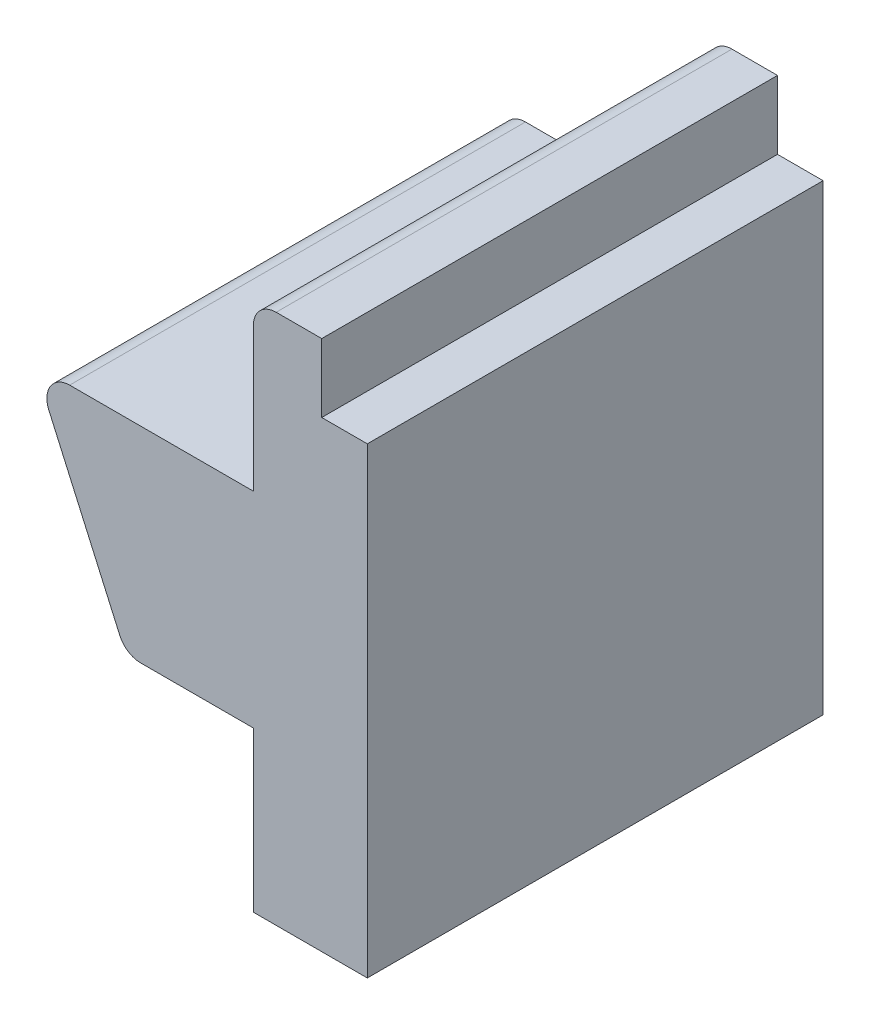
ISO-10303-21;
HEADER;
FILE_DESCRIPTION(('STEP AP214'),'2;1');
FILE_NAME('part.step','',(''),(''),'','','');
FILE_SCHEMA(('AUTOMOTIVE_DESIGN { 1 0 10303 214 1 1 1 1 }'));
ENDSEC;
DATA;
#1=APPLICATION_CONTEXT('core data for automotive mechanical design processes');
#2=APPLICATION_PROTOCOL_DEFINITION('international standard','automotive_design',2000,#1);
#3=PRODUCT_CONTEXT('',#1,'mechanical');
#4=PRODUCT('Part','Part','',(#3));
#5=PRODUCT_RELATED_PRODUCT_CATEGORY('part','',(#4));
#6=PRODUCT_DEFINITION_FORMATION('','',#4);
#7=PRODUCT_DEFINITION_CONTEXT('part definition',#1,'design');
#8=PRODUCT_DEFINITION('design','',#6,#7);
#9=PRODUCT_DEFINITION_SHAPE('','',#8);
#10=(LENGTH_UNIT() NAMED_UNIT(*) SI_UNIT(.MILLI.,.METRE.));
#11=(NAMED_UNIT(*) PLANE_ANGLE_UNIT() SI_UNIT($,.RADIAN.));
#12=(NAMED_UNIT(*) SI_UNIT($,.STERADIAN.) SOLID_ANGLE_UNIT());
#13=UNCERTAINTY_MEASURE_WITH_UNIT(LENGTH_MEASURE(1.E-05),#10,'distance_accuracy_value','');
#14=(GEOMETRIC_REPRESENTATION_CONTEXT(3) GLOBAL_UNCERTAINTY_ASSIGNED_CONTEXT((#13)) GLOBAL_UNIT_ASSIGNED_CONTEXT((#10,
#11,#12)) REPRESENTATION_CONTEXT('',''));
#15=CARTESIAN_POINT('',(0.,0.,0.));
#16=DIRECTION('',(0.,0.,1.));
#17=DIRECTION('',(1.,0.,0.));
#18=AXIS2_PLACEMENT_3D('',#15,#16,#17);
#19=CARTESIAN_POINT('',(-2.,23.3,20.));
#20=DIRECTION('',(-1.,0.,0.));
#21=DIRECTION('',(0.,-1.,0.));
#22=AXIS2_PLACEMENT_3D('',#19,#20,#21);
#23=PLANE('',#22);
#24=DIRECTION('',(0.,1.,0.));
#25=VECTOR('',#24,1.);
#26=CARTESIAN_POINT('',(-2.,23.3,0.));
#27=LINE('',#26,#25);
#28=CARTESIAN_POINT('',(-2.,20.3,0.));
#29=VERTEX_POINT('',#28);
#30=CARTESIAN_POINT('',(-2.,23.3,0.));
#31=VERTEX_POINT('',#30);
#32=EDGE_CURVE('E151',#29,#31,#27,.T.);
#33=ORIENTED_EDGE('',*,*,#32,.T.);
#34=DIRECTION('',(0.,0.,-1.));
#35=VECTOR('',#34,1.);
#36=CARTESIAN_POINT('',(-2.,23.3,20.));
#37=LINE('',#36,#35);
#38=CARTESIAN_POINT('',(-2.,23.3,20.));
#39=VERTEX_POINT('',#38);
#40=EDGE_CURVE('E133',#39,#31,#37,.T.);
#41=ORIENTED_EDGE('',*,*,#40,.F.);
#42=DIRECTION('',(0.,1.,0.));
#43=VECTOR('',#42,1.);
#44=CARTESIAN_POINT('',(-2.,23.3,20.));
#45=LINE('',#44,#43);
#46=CARTESIAN_POINT('',(-2.,20.3,20.));
#47=VERTEX_POINT('',#46);
#48=EDGE_CURVE('E139',#47,#39,#45,.T.);
#49=ORIENTED_EDGE('',*,*,#48,.F.);
#50=DIRECTION('',(0.,0.,-1.));
#51=VECTOR('',#50,1.);
#52=CARTESIAN_POINT('',(-2.,20.3,20.));
#53=LINE('',#52,#51);
#54=EDGE_CURVE('E207',#47,#29,#53,.T.);
#55=ORIENTED_EDGE('',*,*,#54,.T.);
#56=EDGE_LOOP('',(#33,#41,#49,#55));
#57=FACE_BOUND('',#56,.T.);
#58=ADVANCED_FACE('F33',(#57),#23,.F.);
#59=CARTESIAN_POINT('',(-2.,23.3,20.));
#60=DIRECTION('',(0.,-1.,0.));
#61=DIRECTION('',(0.,0.,-1.));
#62=AXIS2_PLACEMENT_3D('',#59,#60,#61);
#63=PLANE('',#62);
#64=DIRECTION('',(-1.,0.,0.));
#65=VECTOR('',#64,1.);
#66=CARTESIAN_POINT('',(-2.,23.3,0.));
#67=LINE('',#66,#65);
#68=CARTESIAN_POINT('',(-4.,23.3,0.));
#69=VERTEX_POINT('',#68);
#70=EDGE_CURVE('E245',#31,#69,#67,.T.);
#71=ORIENTED_EDGE('',*,*,#70,.T.);
#72=DIRECTION('',(0.,0.,-1.));
#73=VECTOR('',#72,1.);
#74=CARTESIAN_POINT('',(-4.,23.3,20.));
#75=LINE('',#74,#73);
#76=CARTESIAN_POINT('',(-4.,23.3,20.));
#77=VERTEX_POINT('',#76);
#78=EDGE_CURVE('E136',#69,#77,#75,.F.);
#79=ORIENTED_EDGE('',*,*,#78,.T.);
#80=DIRECTION('',(-1.,0.,0.));
#81=VECTOR('',#80,1.);
#82=CARTESIAN_POINT('',(-2.,23.3,20.));
#83=LINE('',#82,#81);
#84=EDGE_CURVE('E128',#39,#77,#83,.T.);
#85=ORIENTED_EDGE('',*,*,#84,.F.);
#86=ORIENTED_EDGE('',*,*,#40,.T.);
#87=EDGE_LOOP('',(#71,#79,#85,#86));
#88=FACE_BOUND('',#87,.T.);
#89=ADVANCED_FACE('F131',(#88),#63,.F.);
#90=CARTESIAN_POINT('',(-5.,16.,20.));
#91=DIRECTION('',(1.,0.,0.));
#92=DIRECTION('',(0.,0.,-1.));
#93=AXIS2_PLACEMENT_3D('',#90,#91,#92);
#94=PLANE('',#93);
#95=DIRECTION('',(0.,-1.,0.));
#96=VECTOR('',#95,1.);
#97=CARTESIAN_POINT('',(-5.,16.,20.));
#98=LINE('',#97,#96);
#99=CARTESIAN_POINT('',(-5.,22.3,20.));
#100=VERTEX_POINT('',#99);
#101=CARTESIAN_POINT('',(-5.,16.,20.));
#102=VERTEX_POINT('',#101);
#103=EDGE_CURVE('E138',#100,#102,#98,.T.);
#104=ORIENTED_EDGE('',*,*,#103,.F.);
#105=DIRECTION('',(0.,0.,-1.));
#106=VECTOR('',#105,1.);
#107=CARTESIAN_POINT('',(-5.,22.3,20.));
#108=LINE('',#107,#106);
#109=CARTESIAN_POINT('',(-5.,22.3,0.));
#110=VERTEX_POINT('',#109);
#111=EDGE_CURVE('E152',#100,#110,#108,.T.);
#112=ORIENTED_EDGE('',*,*,#111,.T.);
#113=DIRECTION('',(0.,-1.,0.));
#114=VECTOR('',#113,1.);
#115=CARTESIAN_POINT('',(-5.,16.,0.));
#116=LINE('',#115,#114);
#117=CARTESIAN_POINT('',(-5.,16.,0.));
#118=VERTEX_POINT('',#117);
#119=EDGE_CURVE('E197',#110,#118,#116,.T.);
#120=ORIENTED_EDGE('',*,*,#119,.T.);
#121=DIRECTION('',(0.,0.,-1.));
#122=VECTOR('',#121,1.);
#123=CARTESIAN_POINT('',(-5.,16.,20.));
#124=LINE('',#123,#122);
#125=EDGE_CURVE('E153',#102,#118,#124,.T.);
#126=ORIENTED_EDGE('',*,*,#125,.F.);
#127=EDGE_LOOP('',(#104,#112,#120,#126));
#128=FACE_BOUND('',#127,.T.);
#129=ADVANCED_FACE('F250',(#128),#94,.F.);
#130=CARTESIAN_POINT('',(-5.,16.,20.));
#131=DIRECTION('',(0.,-1.,0.));
#132=DIRECTION('',(0.,0.,-1.));
#133=AXIS2_PLACEMENT_3D('',#130,#131,#132);
#134=PLANE('',#133);
#135=DIRECTION('',(-1.,0.,0.));
#136=VECTOR('',#135,1.);
#137=CARTESIAN_POINT('',(-5.,16.,0.));
#138=LINE('',#137,#136);
#139=CARTESIAN_POINT('',(-13.0612380220227,16.,0.));
#140=VERTEX_POINT('',#139);
#141=EDGE_CURVE('E193',#118,#140,#138,.T.);
#142=ORIENTED_EDGE('',*,*,#141,.T.);
#143=DIRECTION('',(0.,0.,-1.));
#144=VECTOR('',#143,1.);
#145=CARTESIAN_POINT('',(-13.0612380220227,16.,20.));
#146=LINE('',#145,#144);
#147=CARTESIAN_POINT('',(-13.0612380220227,16.,20.));
#148=VERTEX_POINT('',#147);
#149=EDGE_CURVE('E11',#140,#148,#146,.F.);
#150=ORIENTED_EDGE('',*,*,#149,.T.);
#151=DIRECTION('',(-1.,0.,0.));
#152=VECTOR('',#151,1.);
#153=CARTESIAN_POINT('',(-5.,16.,20.));
#154=LINE('',#153,#152);
#155=EDGE_CURVE('E257',#102,#148,#154,.T.);
#156=ORIENTED_EDGE('',*,*,#155,.F.);
#157=ORIENTED_EDGE('',*,*,#125,.T.);
#158=EDGE_LOOP('',(#142,#150,#156,#157));
#159=FACE_BOUND('',#158,.T.);
#160=ADVANCED_FACE('F254',(#159),#134,.F.);
#161=CARTESIAN_POINT('',(-14.6,16.,20.));
#162=DIRECTION('',(0.913811548620257,0.406138466053448,0.));
#163=DIRECTION('',(-0.406138466053448,0.913811548620257,0.));
#164=AXIS2_PLACEMENT_3D('',#161,#162,#163);
#165=PLANE('',#164);
#166=DIRECTION('',(0.406138466053448,-0.913811548620257,0.));
#167=VECTOR('',#166,1.);
#168=CARTESIAN_POINT('',(-14.6,16.,0.));
#169=LINE('',#168,#167);
#170=CARTESIAN_POINT('',(-13.9750495706429,14.5938615339466,0.));
#171=VERTEX_POINT('',#170);
#172=CARTESIAN_POINT('',(-10.8639384595318,7.59386153394655,0.));
#173=VERTEX_POINT('',#172);
#174=EDGE_CURVE('E182',#171,#173,#169,.T.);
#175=ORIENTED_EDGE('',*,*,#174,.T.);
#176=DIRECTION('',(0.,0.,-1.));
#177=VECTOR('',#176,1.);
#178=CARTESIAN_POINT('',(-10.8639384595318,7.59386153394655,20.));
#179=LINE('',#178,#177);
#180=CARTESIAN_POINT('',(-10.8639384595318,7.59386153394655,20.));
#181=VERTEX_POINT('',#180);
#182=EDGE_CURVE('E41',#173,#181,#179,.F.);
#183=ORIENTED_EDGE('',*,*,#182,.T.);
#184=DIRECTION('',(0.406138466053448,-0.913811548620257,0.));
#185=VECTOR('',#184,1.);
#186=CARTESIAN_POINT('',(-14.6,16.,20.));
#187=LINE('',#186,#185);
#188=CARTESIAN_POINT('',(-13.9750495706429,14.5938615339466,20.));
#189=VERTEX_POINT('',#188);
#190=EDGE_CURVE('E183',#189,#181,#187,.T.);
#191=ORIENTED_EDGE('',*,*,#190,.F.);
#192=DIRECTION('',(0.,0.,-1.));
#193=VECTOR('',#192,1.);
#194=CARTESIAN_POINT('',(-13.9750495706429,14.5938615339466,20.));
#195=LINE('',#194,#193);
#196=EDGE_CURVE('E177',#189,#171,#195,.T.);
#197=ORIENTED_EDGE('',*,*,#196,.T.);
#198=EDGE_LOOP('',(#175,#183,#191,#197));
#199=FACE_BOUND('',#198,.T.);
#200=ADVANCED_FACE('F181',(#199),#165,.F.);
#201=CARTESIAN_POINT('',(-10.6,7.,20.));
#202=DIRECTION('',(0.,1.,0.));
#203=DIRECTION('',(0.,0.,1.));
#204=AXIS2_PLACEMENT_3D('',#201,#202,#203);
#205=PLANE('',#204);
#206=DIRECTION('',(1.,0.,0.));
#207=VECTOR('',#206,1.);
#208=CARTESIAN_POINT('',(-10.6,7.,20.));
#209=LINE('',#208,#207);
#210=CARTESIAN_POINT('',(-9.95012691091155,7.,20.));
#211=VERTEX_POINT('',#210);
#212=CARTESIAN_POINT('',(-5.,7.,20.));
#213=VERTEX_POINT('',#212);
#214=EDGE_CURVE('E259',#211,#213,#209,.T.);
#215=ORIENTED_EDGE('',*,*,#214,.F.);
#216=DIRECTION('',(0.,0.,-1.));
#217=VECTOR('',#216,1.);
#218=CARTESIAN_POINT('',(-9.95012691091155,7.,20.));
#219=LINE('',#218,#217);
#220=CARTESIAN_POINT('',(-9.95012691091155,7.,0.));
#221=VERTEX_POINT('',#220);
#222=EDGE_CURVE('E174',#211,#221,#219,.T.);
#223=ORIENTED_EDGE('',*,*,#222,.T.);
#224=DIRECTION('',(1.,0.,0.));
#225=VECTOR('',#224,1.);
#226=CARTESIAN_POINT('',(-10.6,7.,0.));
#227=LINE('',#226,#225);
#228=CARTESIAN_POINT('',(-5.,7.,0.));
#229=VERTEX_POINT('',#228);
#230=EDGE_CURVE('E192',#221,#229,#227,.T.);
#231=ORIENTED_EDGE('',*,*,#230,.T.);
#232=DIRECTION('',(0.,0.,-1.));
#233=VECTOR('',#232,1.);
#234=CARTESIAN_POINT('',(-5.,7.,20.));
#235=LINE('',#234,#233);
#236=EDGE_CURVE('E159',#213,#229,#235,.T.);
#237=ORIENTED_EDGE('',*,*,#236,.F.);
#238=EDGE_LOOP('',(#215,#223,#231,#237));
#239=FACE_BOUND('',#238,.T.);
#240=ADVANCED_FACE('F264',(#239),#205,.F.);
#241=CARTESIAN_POINT('',(-5.,7.,20.));
#242=DIRECTION('',(1.,0.,0.));
#243=DIRECTION('',(0.,1.,0.));
#244=AXIS2_PLACEMENT_3D('',#241,#242,#243);
#245=PLANE('',#244);
#246=DIRECTION('',(0.,-1.,0.));
#247=VECTOR('',#246,1.);
#248=CARTESIAN_POINT('',(-5.,7.,0.));
#249=LINE('',#248,#247);
#250=CARTESIAN_POINT('',(-5.,0.,0.));
#251=VERTEX_POINT('',#250);
#252=EDGE_CURVE('E195',#229,#251,#249,.T.);
#253=ORIENTED_EDGE('',*,*,#252,.T.);
#254=DIRECTION('',(0.,0.,-1.));
#255=VECTOR('',#254,1.);
#256=CARTESIAN_POINT('',(-5.,0.,20.));
#257=LINE('',#256,#255);
#258=CARTESIAN_POINT('',(-5.,0.,20.));
#259=VERTEX_POINT('',#258);
#260=EDGE_CURVE('E215',#259,#251,#257,.T.);
#261=ORIENTED_EDGE('',*,*,#260,.F.);
#262=DIRECTION('',(0.,-1.,0.));
#263=VECTOR('',#262,1.);
#264=CARTESIAN_POINT('',(-5.,7.,20.));
#265=LINE('',#264,#263);
#266=EDGE_CURVE('E224',#213,#259,#265,.T.);
#267=ORIENTED_EDGE('',*,*,#266,.F.);
#268=ORIENTED_EDGE('',*,*,#236,.T.);
#269=EDGE_LOOP('',(#253,#261,#267,#268));
#270=FACE_BOUND('',#269,.T.);
#271=ADVANCED_FACE('F222',(#270),#245,.F.);
#272=CARTESIAN_POINT('',(-5.,0.,20.));
#273=DIRECTION('',(0.,1.,0.));
#274=DIRECTION('',(0.,0.,1.));
#275=AXIS2_PLACEMENT_3D('',#272,#273,#274);
#276=PLANE('',#275);
#277=CARTESIAN_POINT('',(-2.5,0.,4.));
#278=DIRECTION('',(0.,-1.,0.));
#279=DIRECTION('',(0.,0.,-1.));
#280=AXIS2_PLACEMENT_3D('',#277,#278,#279);
#281=CIRCLE('',#280,2.);
#282=CARTESIAN_POINT('',(-2.5,0.,2.));
#283=VERTEX_POINT('',#282);
#284=EDGE_CURVE('E324',#283,#283,#281,.T.);
#285=ORIENTED_EDGE('',*,*,#284,.F.);
#286=EDGE_LOOP('',(#285));
#287=FACE_BOUND('',#286,.T.);
#288=CARTESIAN_POINT('',(-2.5,0.,16.));
#289=DIRECTION('',(0.,-1.,0.));
#290=DIRECTION('',(0.,0.,-1.));
#291=AXIS2_PLACEMENT_3D('',#288,#289,#290);
#292=CIRCLE('',#291,2.);
#293=CARTESIAN_POINT('',(-2.5,0.,14.));
#294=VERTEX_POINT('',#293);
#295=EDGE_CURVE('E332',#294,#294,#292,.T.);
#296=ORIENTED_EDGE('',*,*,#295,.F.);
#297=EDGE_LOOP('',(#296));
#298=FACE_BOUND('',#297,.T.);
#299=DIRECTION('',(1.,0.,0.));
#300=VECTOR('',#299,1.);
#301=CARTESIAN_POINT('',(-5.,0.,0.));
#302=LINE('',#301,#300);
#303=CARTESIAN_POINT('',(0.,0.,0.));
#304=VERTEX_POINT('',#303);
#305=EDGE_CURVE('E202',#251,#304,#302,.T.);
#306=ORIENTED_EDGE('',*,*,#305,.T.);
#307=DIRECTION('',(0.,0.,-1.));
#308=VECTOR('',#307,1.);
#309=CARTESIAN_POINT('',(0.,0.,20.));
#310=LINE('',#309,#308);
#311=CARTESIAN_POINT('',(0.,0.,20.));
#312=VERTEX_POINT('',#311);
#313=EDGE_CURVE('E212',#312,#304,#310,.T.);
#314=ORIENTED_EDGE('',*,*,#313,.F.);
#315=DIRECTION('',(1.,0.,0.));
#316=VECTOR('',#315,1.);
#317=CARTESIAN_POINT('',(-5.,0.,20.));
#318=LINE('',#317,#316);
#319=EDGE_CURVE('E238',#259,#312,#318,.T.);
#320=ORIENTED_EDGE('',*,*,#319,.F.);
#321=ORIENTED_EDGE('',*,*,#260,.T.);
#322=EDGE_LOOP('',(#306,#314,#320,#321));
#323=FACE_BOUND('',#322,.T.);
#324=ADVANCED_FACE('F231',(#287,#298,#323),#276,.F.);
#325=CARTESIAN_POINT('',(0.,20.3,20.));
#326=DIRECTION('',(-1.,0.,0.));
#327=DIRECTION('',(0.,0.,1.));
#328=AXIS2_PLACEMENT_3D('',#325,#326,#327);
#329=PLANE('',#328);
#330=DIRECTION('',(0.,1.,0.));
#331=VECTOR('',#330,1.);
#332=CARTESIAN_POINT('',(0.,20.3,0.));
#333=LINE('',#332,#331);
#334=CARTESIAN_POINT('',(0.,20.3,0.));
#335=VERTEX_POINT('',#334);
#336=EDGE_CURVE('E204',#304,#335,#333,.T.);
#337=ORIENTED_EDGE('',*,*,#336,.T.);
#338=DIRECTION('',(0.,0.,-1.));
#339=VECTOR('',#338,1.);
#340=CARTESIAN_POINT('',(0.,20.3,20.));
#341=LINE('',#340,#339);
#342=CARTESIAN_POINT('',(0.,20.3,20.));
#343=VERTEX_POINT('',#342);
#344=EDGE_CURVE('E209',#343,#335,#341,.T.);
#345=ORIENTED_EDGE('',*,*,#344,.F.);
#346=DIRECTION('',(0.,1.,0.));
#347=VECTOR('',#346,1.);
#348=CARTESIAN_POINT('',(0.,20.3,20.));
#349=LINE('',#348,#347);
#350=EDGE_CURVE('E237',#312,#343,#349,.T.);
#351=ORIENTED_EDGE('',*,*,#350,.F.);
#352=ORIENTED_EDGE('',*,*,#313,.T.);
#353=EDGE_LOOP('',(#337,#345,#351,#352));
#354=FACE_BOUND('',#353,.T.);
#355=ADVANCED_FACE('F235',(#354),#329,.F.);
#356=CARTESIAN_POINT('',(-2.,20.3,20.));
#357=DIRECTION('',(0.,-1.,0.));
#358=DIRECTION('',(0.,0.,-1.));
#359=AXIS2_PLACEMENT_3D('',#356,#357,#358);
#360=PLANE('',#359);
#361=DIRECTION('',(-1.,0.,0.));
#362=VECTOR('',#361,1.);
#363=CARTESIAN_POINT('',(-2.,20.3,0.));
#364=LINE('',#363,#362);
#365=EDGE_CURVE('E148',#335,#29,#364,.T.);
#366=ORIENTED_EDGE('',*,*,#365,.T.);
#367=ORIENTED_EDGE('',*,*,#54,.F.);
#368=DIRECTION('',(-1.,0.,0.));
#369=VECTOR('',#368,1.);
#370=CARTESIAN_POINT('',(-2.,20.3,20.));
#371=LINE('',#370,#369);
#372=EDGE_CURVE('E144',#343,#47,#371,.T.);
#373=ORIENTED_EDGE('',*,*,#372,.F.);
#374=ORIENTED_EDGE('',*,*,#344,.T.);
#375=EDGE_LOOP('',(#366,#367,#373,#374));
#376=FACE_BOUND('',#375,.T.);
#377=ADVANCED_FACE('F298',(#376),#360,.F.);
#378=CARTESIAN_POINT('',(0.,0.,20.));
#379=DIRECTION('',(0.,0.,1.));
#380=DIRECTION('',(1.,0.,0.));
#381=AXIS2_PLACEMENT_3D('',#378,#379,#380);
#382=PLANE('',#381);
#383=ORIENTED_EDGE('',*,*,#84,.T.);
#384=CARTESIAN_POINT('',(-4.,22.3,20.));
#385=DIRECTION('',(0.,0.,1.));
#386=DIRECTION('',(1.,0.,0.));
#387=AXIS2_PLACEMENT_3D('',#384,#385,#386);
#388=CIRCLE('',#387,1.);
#389=EDGE_CURVE('E172',#77,#100,#388,.T.);
#390=ORIENTED_EDGE('',*,*,#389,.T.);
#391=ORIENTED_EDGE('',*,*,#103,.T.);
#392=ORIENTED_EDGE('',*,*,#155,.T.);
#393=CARTESIAN_POINT('',(-13.0612380220227,15.,20.));
#394=DIRECTION('',(0.,0.,1.));
#395=DIRECTION('',(1.,0.,0.));
#396=AXIS2_PLACEMENT_3D('',#393,#394,#395);
#397=CIRCLE('',#396,1.);
#398=EDGE_CURVE('E169',#148,#189,#397,.T.);
#399=ORIENTED_EDGE('',*,*,#398,.T.);
#400=ORIENTED_EDGE('',*,*,#190,.T.);
#401=CARTESIAN_POINT('',(-9.95012691091155,8.,20.));
#402=DIRECTION('',(0.,0.,1.));
#403=DIRECTION('',(1.,0.,0.));
#404=AXIS2_PLACEMENT_3D('',#401,#402,#403);
#405=CIRCLE('',#404,1.);
#406=EDGE_CURVE('E48',#181,#211,#405,.T.);
#407=ORIENTED_EDGE('',*,*,#406,.T.);
#408=ORIENTED_EDGE('',*,*,#214,.T.);
#409=ORIENTED_EDGE('',*,*,#266,.T.);
#410=ORIENTED_EDGE('',*,*,#319,.T.);
#411=ORIENTED_EDGE('',*,*,#350,.T.);
#412=ORIENTED_EDGE('',*,*,#372,.T.);
#413=ORIENTED_EDGE('',*,*,#48,.T.);
#414=EDGE_LOOP('',(#383,#390,#391,#392,#399,#400,#407,#408,#409,#410,#411,#412,#413));
#415=FACE_BOUND('',#414,.T.);
#416=ADVANCED_FACE('F142',(#415),#382,.T.);
#417=CARTESIAN_POINT('',(0.,0.,0.));
#418=DIRECTION('',(0.,0.,1.));
#419=DIRECTION('',(1.,0.,0.));
#420=AXIS2_PLACEMENT_3D('',#417,#418,#419);
#421=PLANE('',#420);
#422=ORIENTED_EDGE('',*,*,#119,.F.);
#423=CARTESIAN_POINT('',(-4.,22.3,0.));
#424=DIRECTION('',(0.,0.,1.));
#425=DIRECTION('',(1.,0.,0.));
#426=AXIS2_PLACEMENT_3D('',#423,#424,#425);
#427=CIRCLE('',#426,1.);
#428=EDGE_CURVE('E166',#110,#69,#427,.F.);
#429=ORIENTED_EDGE('',*,*,#428,.T.);
#430=ORIENTED_EDGE('',*,*,#70,.F.);
#431=ORIENTED_EDGE('',*,*,#32,.F.);
#432=ORIENTED_EDGE('',*,*,#365,.F.);
#433=ORIENTED_EDGE('',*,*,#336,.F.);
#434=ORIENTED_EDGE('',*,*,#305,.F.);
#435=ORIENTED_EDGE('',*,*,#252,.F.);
#436=ORIENTED_EDGE('',*,*,#230,.F.);
#437=CARTESIAN_POINT('',(-9.95012691091155,8.,0.));
#438=DIRECTION('',(0.,0.,1.));
#439=DIRECTION('',(1.,0.,0.));
#440=AXIS2_PLACEMENT_3D('',#437,#438,#439);
#441=CIRCLE('',#440,1.);
#442=EDGE_CURVE('E164',#221,#173,#441,.F.);
#443=ORIENTED_EDGE('',*,*,#442,.T.);
#444=ORIENTED_EDGE('',*,*,#174,.F.);
#445=CARTESIAN_POINT('',(-13.0612380220227,15.,0.));
#446=DIRECTION('',(0.,0.,1.));
#447=DIRECTION('',(1.,0.,0.));
#448=AXIS2_PLACEMENT_3D('',#445,#446,#447);
#449=CIRCLE('',#448,1.);
#450=EDGE_CURVE('E156',#171,#140,#449,.F.);
#451=ORIENTED_EDGE('',*,*,#450,.T.);
#452=ORIENTED_EDGE('',*,*,#141,.F.);
#453=EDGE_LOOP('',(#422,#429,#430,#431,#432,#433,#434,#435,#436,#443,#444,#451,#452));
#454=FACE_BOUND('',#453,.T.);
#455=ADVANCED_FACE('F188',(#454),#421,.F.);
#456=CARTESIAN_POINT('',(-4.,22.3,20.));
#457=DIRECTION('',(0.,0.,-1.));
#458=DIRECTION('',(-1.,0.,0.));
#459=AXIS2_PLACEMENT_3D('',#456,#457,#458);
#460=CYLINDRICAL_SURFACE('',#459,1.);
#461=ORIENTED_EDGE('',*,*,#389,.F.);
#462=ORIENTED_EDGE('',*,*,#78,.F.);
#463=ORIENTED_EDGE('',*,*,#428,.F.);
#464=ORIENTED_EDGE('',*,*,#111,.F.);
#465=EDGE_LOOP('',(#461,#462,#463,#464));
#466=FACE_BOUND('',#465,.T.);
#467=ADVANCED_FACE('F268',(#466),#460,.T.);
#468=CARTESIAN_POINT('',(-9.95012691091155,8.,20.));
#469=DIRECTION('',(0.,0.,-1.));
#470=DIRECTION('',(-1.,0.,0.));
#471=AXIS2_PLACEMENT_3D('',#468,#469,#470);
#472=CYLINDRICAL_SURFACE('',#471,1.);
#473=ORIENTED_EDGE('',*,*,#406,.F.);
#474=ORIENTED_EDGE('',*,*,#182,.F.);
#475=ORIENTED_EDGE('',*,*,#442,.F.);
#476=ORIENTED_EDGE('',*,*,#222,.F.);
#477=EDGE_LOOP('',(#473,#474,#475,#476));
#478=FACE_BOUND('',#477,.T.);
#479=ADVANCED_FACE('F266',(#478),#472,.T.);
#480=CARTESIAN_POINT('',(-13.0612380220227,15.,20.));
#481=DIRECTION('',(0.,0.,-1.));
#482=DIRECTION('',(-1.,0.,0.));
#483=AXIS2_PLACEMENT_3D('',#480,#481,#482);
#484=CYLINDRICAL_SURFACE('',#483,1.);
#485=ORIENTED_EDGE('',*,*,#398,.F.);
#486=ORIENTED_EDGE('',*,*,#149,.F.);
#487=ORIENTED_EDGE('',*,*,#450,.F.);
#488=ORIENTED_EDGE('',*,*,#196,.F.);
#489=EDGE_LOOP('',(#485,#486,#487,#488));
#490=FACE_BOUND('',#489,.T.);
#491=ADVANCED_FACE('F35',(#490),#484,.T.);
#492=CARTESIAN_POINT('',(-2.5,5.,16.));
#493=DIRECTION('',(0.,-1.,0.));
#494=DIRECTION('',(0.,0.,-1.));
#495=AXIS2_PLACEMENT_3D('',#492,#493,#494);
#496=CYLINDRICAL_SURFACE('',#495,2.);
#497=CARTESIAN_POINT('',(-2.5,5.,16.));
#498=DIRECTION('',(0.,-1.,0.));
#499=DIRECTION('',(0.,0.,-1.));
#500=AXIS2_PLACEMENT_3D('',#497,#498,#499);
#501=CIRCLE('',#500,2.);
#502=CARTESIAN_POINT('',(-2.5,5.,14.));
#503=VERTEX_POINT('',#502);
#504=EDGE_CURVE('E327',#503,#503,#501,.T.);
#505=ORIENTED_EDGE('',*,*,#504,.F.);
#506=EDGE_LOOP('',(#505));
#507=FACE_BOUND('',#506,.T.);
#508=ORIENTED_EDGE('',*,*,#295,.T.);
#509=EDGE_LOOP('',(#508));
#510=FACE_BOUND('',#509,.T.);
#511=ADVANCED_FACE('F273',(#507,#510),#496,.F.);
#512=CARTESIAN_POINT('',(-2.5,5.,16.));
#513=DIRECTION('',(0.,-1.,0.));
#514=DIRECTION('',(0.,0.,-1.));
#515=AXIS2_PLACEMENT_3D('',#512,#513,#514);
#516=PLANE('',#515);
#517=ORIENTED_EDGE('',*,*,#504,.T.);
#518=EDGE_LOOP('',(#517));
#519=FACE_BOUND('',#518,.T.);
#520=ADVANCED_FACE('F308',(#519),#516,.T.);
#521=CARTESIAN_POINT('',(-2.5,5.,4.));
#522=DIRECTION('',(0.,-1.,0.));
#523=DIRECTION('',(0.,0.,-1.));
#524=AXIS2_PLACEMENT_3D('',#521,#522,#523);
#525=CYLINDRICAL_SURFACE('',#524,2.);
#526=CARTESIAN_POINT('',(-2.5,5.,4.));
#527=DIRECTION('',(0.,-1.,0.));
#528=DIRECTION('',(0.,0.,-1.));
#529=AXIS2_PLACEMENT_3D('',#526,#527,#528);
#530=CIRCLE('',#529,2.);
#531=CARTESIAN_POINT('',(-2.5,5.,2.));
#532=VERTEX_POINT('',#531);
#533=EDGE_CURVE('E246',#532,#532,#530,.T.);
#534=ORIENTED_EDGE('',*,*,#533,.F.);
#535=EDGE_LOOP('',(#534));
#536=FACE_BOUND('',#535,.T.);
#537=ORIENTED_EDGE('',*,*,#284,.T.);
#538=EDGE_LOOP('',(#537));
#539=FACE_BOUND('',#538,.T.);
#540=ADVANCED_FACE('F312',(#536,#539),#525,.F.);
#541=CARTESIAN_POINT('',(-2.5,5.,4.));
#542=DIRECTION('',(0.,-1.,0.));
#543=DIRECTION('',(0.,0.,-1.));
#544=AXIS2_PLACEMENT_3D('',#541,#542,#543);
#545=PLANE('',#544);
#546=ORIENTED_EDGE('',*,*,#533,.T.);
#547=EDGE_LOOP('',(#546));
#548=FACE_BOUND('',#547,.T.);
#549=ADVANCED_FACE('F316',(#548),#545,.T.);
#550=CLOSED_SHELL('',(#58,#89,#129,#160,#200,#240,#271,#324,#355,#377,#416,#455,#467,#479,#491,
#511,#520,#540,#549));
#551=MANIFOLD_SOLID_BREP('B2',#550);
#552=ADVANCED_BREP_SHAPE_REPRESENTATION('',(#18,#551),#14);
#553=SHAPE_DEFINITION_REPRESENTATION(#9,#552);
ENDSEC;
END-ISO-10303-21;
